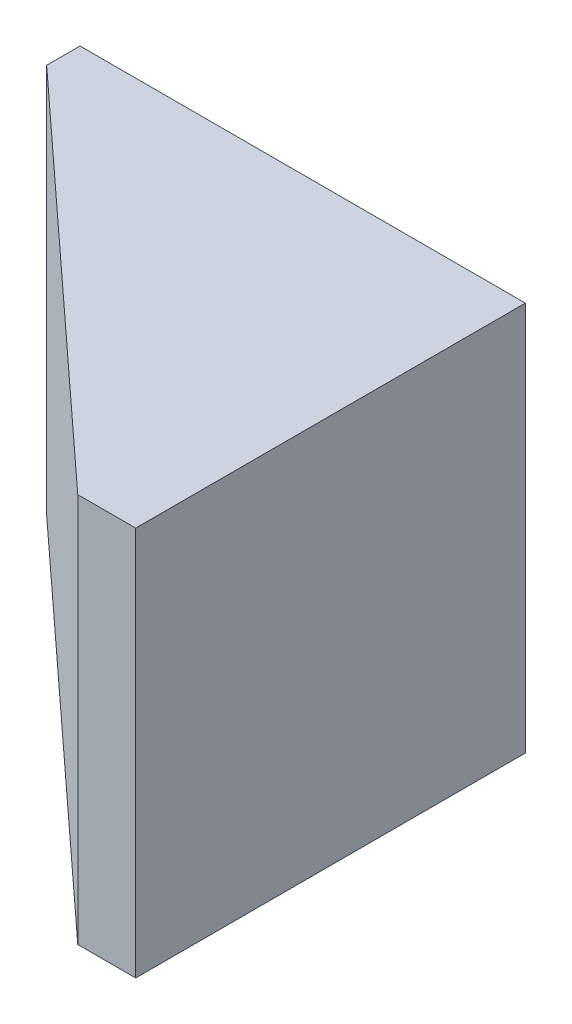
ISO-10303-21;
HEADER;
FILE_DESCRIPTION(('STEP AP214'),'2;1');
FILE_NAME('part.step','',(''),(''),'','','');
FILE_SCHEMA(('AUTOMOTIVE_DESIGN { 1 0 10303 214 1 1 1 1 }'));
ENDSEC;
DATA;
#1=APPLICATION_CONTEXT('core data for automotive mechanical design processes');
#2=APPLICATION_PROTOCOL_DEFINITION('international standard','automotive_design',2000,#1);
#3=PRODUCT_CONTEXT('',#1,'mechanical');
#4=PRODUCT('Part','Part','',(#3));
#5=PRODUCT_RELATED_PRODUCT_CATEGORY('part','',(#4));
#6=PRODUCT_DEFINITION_FORMATION('','',#4);
#7=PRODUCT_DEFINITION_CONTEXT('part definition',#1,'design');
#8=PRODUCT_DEFINITION('design','',#6,#7);
#9=PRODUCT_DEFINITION_SHAPE('','',#8);
#10=(LENGTH_UNIT() NAMED_UNIT(*) SI_UNIT(.MILLI.,.METRE.));
#11=(NAMED_UNIT(*) PLANE_ANGLE_UNIT() SI_UNIT($,.RADIAN.));
#12=(NAMED_UNIT(*) SI_UNIT($,.STERADIAN.) SOLID_ANGLE_UNIT());
#13=UNCERTAINTY_MEASURE_WITH_UNIT(LENGTH_MEASURE(1.E-05),#10,'distance_accuracy_value','');
#14=(GEOMETRIC_REPRESENTATION_CONTEXT(3) GLOBAL_UNCERTAINTY_ASSIGNED_CONTEXT((#13)) GLOBAL_UNIT_ASSIGNED_CONTEXT((#10,
#11,#12)) REPRESENTATION_CONTEXT('',''));
#15=CARTESIAN_POINT('',(0.,0.,0.));
#16=DIRECTION('',(0.,0.,1.));
#17=DIRECTION('',(1.,0.,0.));
#18=AXIS2_PLACEMENT_3D('',#15,#16,#17);
#19=CARTESIAN_POINT('',(80.,70.,0.));
#20=DIRECTION('',(0.,0.,1.));
#21=DIRECTION('',(1.,0.,0.));
#22=AXIS2_PLACEMENT_3D('',#19,#20,#21);
#23=PLANE('',#22);
#24=DIRECTION('',(-1.,0.,0.));
#25=VECTOR('',#24,1.);
#26=CARTESIAN_POINT('',(80.,0.,0.));
#27=LINE('',#26,#25);
#28=CARTESIAN_POINT('',(80.,0.,0.));
#29=VERTEX_POINT('',#28);
#30=CARTESIAN_POINT('',(0.,0.,0.));
#31=VERTEX_POINT('',#30);
#32=EDGE_CURVE('E113',#29,#31,#27,.T.);
#33=ORIENTED_EDGE('',*,*,#32,.T.);
#34=DIRECTION('',(0.,-1.,0.));
#35=VECTOR('',#34,1.);
#36=CARTESIAN_POINT('',(0.,70.,0.));
#37=LINE('',#36,#35);
#38=CARTESIAN_POINT('',(0.,70.,0.));
#39=VERTEX_POINT('',#38);
#40=EDGE_CURVE('E11',#39,#31,#37,.T.);
#41=ORIENTED_EDGE('',*,*,#40,.F.);
#42=DIRECTION('',(-1.,0.,0.));
#43=VECTOR('',#42,1.);
#44=CARTESIAN_POINT('',(80.,70.,0.));
#45=LINE('',#44,#43);
#46=CARTESIAN_POINT('',(80.,70.,0.));
#47=VERTEX_POINT('',#46);
#48=EDGE_CURVE('E121',#47,#39,#45,.T.);
#49=ORIENTED_EDGE('',*,*,#48,.F.);
#50=DIRECTION('',(0.,-1.,0.));
#51=VECTOR('',#50,1.);
#52=CARTESIAN_POINT('',(80.,70.,0.));
#53=LINE('',#52,#51);
#54=EDGE_CURVE('E109',#47,#29,#53,.T.);
#55=ORIENTED_EDGE('',*,*,#54,.T.);
#56=EDGE_LOOP('',(#33,#41,#49,#55));
#57=FACE_BOUND('',#56,.T.);
#58=ADVANCED_FACE('F39',(#57),#23,.F.);
#59=CARTESIAN_POINT('',(0.,70.,0.));
#60=DIRECTION('',(1.,0.,0.));
#61=DIRECTION('',(0.,0.,-1.));
#62=AXIS2_PLACEMENT_3D('',#59,#60,#61);
#63=PLANE('',#62);
#64=DIRECTION('',(0.,0.,1.));
#65=VECTOR('',#64,1.);
#66=CARTESIAN_POINT('',(0.,0.,0.));
#67=LINE('',#66,#65);
#68=CARTESIAN_POINT('',(0.,0.,6.));
#69=VERTEX_POINT('',#68);
#70=EDGE_CURVE('E116',#31,#69,#67,.T.);
#71=ORIENTED_EDGE('',*,*,#70,.T.);
#72=DIRECTION('',(0.,-1.,0.));
#73=VECTOR('',#72,1.);
#74=CARTESIAN_POINT('',(0.,70.,6.));
#75=LINE('',#74,#73);
#76=CARTESIAN_POINT('',(0.,70.,6.));
#77=VERTEX_POINT('',#76);
#78=EDGE_CURVE('E47',#77,#69,#75,.T.);
#79=ORIENTED_EDGE('',*,*,#78,.F.);
#80=DIRECTION('',(0.,0.,1.));
#81=VECTOR('',#80,1.);
#82=CARTESIAN_POINT('',(0.,70.,0.));
#83=LINE('',#82,#81);
#84=EDGE_CURVE('E89',#39,#77,#83,.T.);
#85=ORIENTED_EDGE('',*,*,#84,.F.);
#86=ORIENTED_EDGE('',*,*,#40,.T.);
#87=EDGE_LOOP('',(#71,#79,#85,#86));
#88=FACE_BOUND('',#87,.T.);
#89=ADVANCED_FACE('F140',(#88),#63,.F.);
#90=CARTESIAN_POINT('',(0.,70.,6.));
#91=DIRECTION('',(0.676915799746258,0.,-0.736060459509872));
#92=DIRECTION('',(-0.736060459509872,0.,-0.676915799746258));
#93=AXIS2_PLACEMENT_3D('',#90,#91,#92);
#94=PLANE('',#93);
#95=DIRECTION('',(0.736060459509872,0.,0.676915799746258));
#96=VECTOR('',#95,1.);
#97=CARTESIAN_POINT('',(0.,0.,6.));
#98=LINE('',#97,#96);
#99=CARTESIAN_POINT('',(69.5919188565109,0.,70.));
#100=VERTEX_POINT('',#99);
#101=EDGE_CURVE('E104',#69,#100,#98,.T.);
#102=ORIENTED_EDGE('',*,*,#101,.T.);
#103=DIRECTION('',(0.,-1.,0.));
#104=VECTOR('',#103,1.);
#105=CARTESIAN_POINT('',(69.5919188565109,70.,70.));
#106=LINE('',#105,#104);
#107=CARTESIAN_POINT('',(69.5919188565109,70.,70.));
#108=VERTEX_POINT('',#107);
#109=EDGE_CURVE('E101',#108,#100,#106,.T.);
#110=ORIENTED_EDGE('',*,*,#109,.F.);
#111=DIRECTION('',(0.736060459509872,0.,0.676915799746258));
#112=VECTOR('',#111,1.);
#113=CARTESIAN_POINT('',(0.,70.,6.));
#114=LINE('',#113,#112);
#115=EDGE_CURVE('E93',#77,#108,#114,.T.);
#116=ORIENTED_EDGE('',*,*,#115,.F.);
#117=ORIENTED_EDGE('',*,*,#78,.T.);
#118=EDGE_LOOP('',(#102,#110,#116,#117));
#119=FACE_BOUND('',#118,.T.);
#120=ADVANCED_FACE('F102',(#119),#94,.F.);
#121=CARTESIAN_POINT('',(69.5919188565109,70.,70.));
#122=DIRECTION('',(0.,0.,-1.));
#123=DIRECTION('',(-1.,0.,0.));
#124=AXIS2_PLACEMENT_3D('',#121,#122,#123);
#125=PLANE('',#124);
#126=DIRECTION('',(1.,0.,0.));
#127=VECTOR('',#126,1.);
#128=CARTESIAN_POINT('',(69.5919188565109,0.,70.));
#129=LINE('',#128,#127);
#130=CARTESIAN_POINT('',(80.,0.,70.));
#131=VERTEX_POINT('',#130);
#132=EDGE_CURVE('E75',#100,#131,#129,.T.);
#133=ORIENTED_EDGE('',*,*,#132,.T.);
#134=DIRECTION('',(0.,-1.,0.));
#135=VECTOR('',#134,1.);
#136=CARTESIAN_POINT('',(80.,70.,70.));
#137=LINE('',#136,#135);
#138=CARTESIAN_POINT('',(80.,70.,70.));
#139=VERTEX_POINT('',#138);
#140=EDGE_CURVE('E105',#139,#131,#137,.T.);
#141=ORIENTED_EDGE('',*,*,#140,.F.);
#142=DIRECTION('',(1.,0.,0.));
#143=VECTOR('',#142,1.);
#144=CARTESIAN_POINT('',(69.5919188565109,70.,70.));
#145=LINE('',#144,#143);
#146=EDGE_CURVE('E97',#108,#139,#145,.T.);
#147=ORIENTED_EDGE('',*,*,#146,.F.);
#148=ORIENTED_EDGE('',*,*,#109,.T.);
#149=EDGE_LOOP('',(#133,#141,#147,#148));
#150=FACE_BOUND('',#149,.T.);
#151=ADVANCED_FACE('F107',(#150),#125,.F.);
#152=CARTESIAN_POINT('',(80.,70.,70.));
#153=DIRECTION('',(-1.,0.,0.));
#154=DIRECTION('',(0.,0.,1.));
#155=AXIS2_PLACEMENT_3D('',#152,#153,#154);
#156=PLANE('',#155);
#157=DIRECTION('',(0.,0.,-1.));
#158=VECTOR('',#157,1.);
#159=CARTESIAN_POINT('',(80.,0.,70.));
#160=LINE('',#159,#158);
#161=EDGE_CURVE('E81',#131,#29,#160,.T.);
#162=ORIENTED_EDGE('',*,*,#161,.T.);
#163=ORIENTED_EDGE('',*,*,#54,.F.);
#164=DIRECTION('',(0.,0.,-1.));
#165=VECTOR('',#164,1.);
#166=CARTESIAN_POINT('',(80.,70.,70.));
#167=LINE('',#166,#165);
#168=EDGE_CURVE('E55',#139,#47,#167,.T.);
#169=ORIENTED_EDGE('',*,*,#168,.F.);
#170=ORIENTED_EDGE('',*,*,#140,.T.);
#171=EDGE_LOOP('',(#162,#163,#169,#170));
#172=FACE_BOUND('',#171,.T.);
#173=ADVANCED_FACE('F129',(#172),#156,.F.);
#174=CARTESIAN_POINT('',(0.,70.,0.));
#175=DIRECTION('',(0.,1.,0.));
#176=DIRECTION('',(0.,0.,1.));
#177=AXIS2_PLACEMENT_3D('',#174,#175,#176);
#178=PLANE('',#177);
#179=ORIENTED_EDGE('',*,*,#48,.T.);
#180=ORIENTED_EDGE('',*,*,#84,.T.);
#181=ORIENTED_EDGE('',*,*,#115,.T.);
#182=ORIENTED_EDGE('',*,*,#146,.T.);
#183=ORIENTED_EDGE('',*,*,#168,.T.);
#184=EDGE_LOOP('',(#179,#180,#181,#182,#183));
#185=FACE_BOUND('',#184,.T.);
#186=ADVANCED_FACE('F95',(#185),#178,.T.);
#187=CARTESIAN_POINT('',(0.,0.,0.));
#188=DIRECTION('',(0.,1.,0.));
#189=DIRECTION('',(0.,0.,1.));
#190=AXIS2_PLACEMENT_3D('',#187,#188,#189);
#191=PLANE('',#190);
#192=ORIENTED_EDGE('',*,*,#32,.F.);
#193=ORIENTED_EDGE('',*,*,#161,.F.);
#194=ORIENTED_EDGE('',*,*,#132,.F.);
#195=ORIENTED_EDGE('',*,*,#101,.F.);
#196=ORIENTED_EDGE('',*,*,#70,.F.);
#197=EDGE_LOOP('',(#192,#193,#194,#195,#196));
#198=FACE_BOUND('',#197,.T.);
#199=ADVANCED_FACE('F125',(#198),#191,.F.);
#200=CLOSED_SHELL('',(#58,#89,#120,#151,#173,#186,#199));
#201=MANIFOLD_SOLID_BREP('B2',#200);
#202=ADVANCED_BREP_SHAPE_REPRESENTATION('',(#18,#201),#14);
#203=SHAPE_DEFINITION_REPRESENTATION(#9,#202);
ENDSEC;
END-ISO-10303-21;
